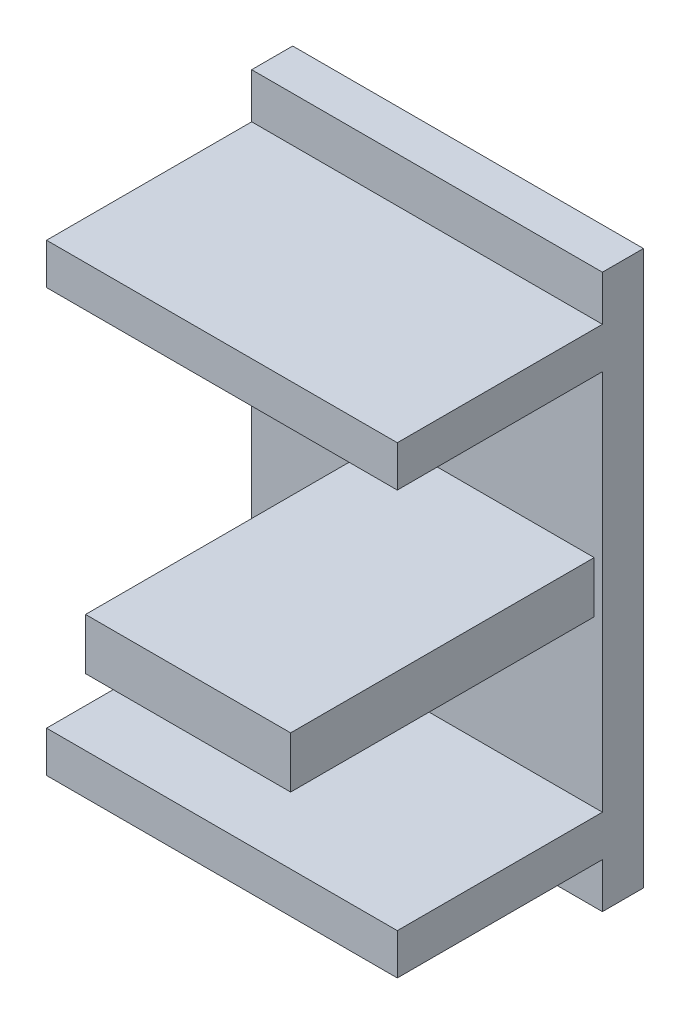
ISO-10303-21;
HEADER;
FILE_DESCRIPTION(('STEP AP214'),'2;1');
FILE_NAME('part.step','',(''),(''),'','','');
FILE_SCHEMA(('AUTOMOTIVE_DESIGN { 1 0 10303 214 1 1 1 1 }'));
ENDSEC;
DATA;
#1=APPLICATION_CONTEXT('core data for automotive mechanical design processes');
#2=APPLICATION_PROTOCOL_DEFINITION('international standard','automotive_design',2000,#1);
#3=PRODUCT_CONTEXT('',#1,'mechanical');
#4=PRODUCT('Part','Part','',(#3));
#5=PRODUCT_RELATED_PRODUCT_CATEGORY('part','',(#4));
#6=PRODUCT_DEFINITION_FORMATION('','',#4);
#7=PRODUCT_DEFINITION_CONTEXT('part definition',#1,'design');
#8=PRODUCT_DEFINITION('design','',#6,#7);
#9=PRODUCT_DEFINITION_SHAPE('','',#8);
#10=(LENGTH_UNIT() NAMED_UNIT(*) SI_UNIT(.MILLI.,.METRE.));
#11=(NAMED_UNIT(*) PLANE_ANGLE_UNIT() SI_UNIT($,.RADIAN.));
#12=(NAMED_UNIT(*) SI_UNIT($,.STERADIAN.) SOLID_ANGLE_UNIT());
#13=UNCERTAINTY_MEASURE_WITH_UNIT(LENGTH_MEASURE(1.E-05),#10,'distance_accuracy_value','');
#14=(GEOMETRIC_REPRESENTATION_CONTEXT(3) GLOBAL_UNCERTAINTY_ASSIGNED_CONTEXT((#13)) GLOBAL_UNIT_ASSIGNED_CONTEXT((#10,
#11,#12)) REPRESENTATION_CONTEXT('',''));
#15=CARTESIAN_POINT('',(0.,0.,0.));
#16=DIRECTION('',(0.,0.,1.));
#17=DIRECTION('',(1.,0.,0.));
#18=AXIS2_PLACEMENT_3D('',#15,#16,#17);
#19=CARTESIAN_POINT('',(0.,0.,5.08));
#20=DIRECTION('',(0.,0.,-1.));
#21=DIRECTION('',(-1.,0.,0.));
#22=AXIS2_PLACEMENT_3D('',#19,#20,#21);
#23=PLANE('',#22);
#24=DIRECTION('',(-1.,0.,0.));
#25=VECTOR('',#24,1.);
#26=CARTESIAN_POINT('',(-43.434,10.668,5.08));
#27=LINE('',#26,#25);
#28=CARTESIAN_POINT('',(0.,10.668,5.08));
#29=VERTEX_POINT('',#28);
#30=CARTESIAN_POINT('',(-43.434,10.668,5.08));
#31=VERTEX_POINT('',#30);
#32=EDGE_CURVE('E199',#29,#31,#27,.T.);
#33=ORIENTED_EDGE('',*,*,#32,.F.);
#34=DIRECTION('',(0.,1.,0.));
#35=VECTOR('',#34,1.);
#36=CARTESIAN_POINT('',(0.,0.,5.08));
#37=LINE('',#36,#35);
#38=CARTESIAN_POINT('',(0.,57.912,5.08));
#39=VERTEX_POINT('',#38);
#40=EDGE_CURVE('E274',#29,#39,#37,.T.);
#41=ORIENTED_EDGE('',*,*,#40,.T.);
#42=DIRECTION('',(1.,0.,0.));
#43=VECTOR('',#42,1.);
#44=CARTESIAN_POINT('',(-43.434,57.912,5.08));
#45=LINE('',#44,#43);
#46=CARTESIAN_POINT('',(-43.434,57.912,5.08));
#47=VERTEX_POINT('',#46);
#48=EDGE_CURVE('E213',#47,#39,#45,.T.);
#49=ORIENTED_EDGE('',*,*,#48,.F.);
#50=DIRECTION('',(0.,-1.,0.));
#51=VECTOR('',#50,1.);
#52=CARTESIAN_POINT('',(-43.434,0.,5.08));
#53=LINE('',#52,#51);
#54=EDGE_CURVE('E282',#47,#31,#53,.T.);
#55=ORIENTED_EDGE('',*,*,#54,.T.);
#56=EDGE_LOOP('',(#33,#41,#49,#55));
#57=FACE_BOUND('',#56,.T.);
#58=DIRECTION('',(0.,-1.,0.));
#59=VECTOR('',#58,1.);
#60=CARTESIAN_POINT('',(-26.416,31.115,5.08));
#61=LINE('',#60,#59);
#62=CARTESIAN_POINT('',(-26.416,37.465,5.08));
#63=VERTEX_POINT('',#62);
#64=CARTESIAN_POINT('',(-26.416,31.115,5.08));
#65=VERTEX_POINT('',#64);
#66=EDGE_CURVE('E181',#63,#65,#61,.T.);
#67=ORIENTED_EDGE('',*,*,#66,.F.);
#68=DIRECTION('',(-1.,0.,0.));
#69=VECTOR('',#68,1.);
#70=CARTESIAN_POINT('',(-26.416,37.465,5.08));
#71=LINE('',#70,#69);
#72=CARTESIAN_POINT('',(-1.01600000000001,37.465,5.08));
#73=VERTEX_POINT('',#72);
#74=EDGE_CURVE('E178',#73,#63,#71,.T.);
#75=ORIENTED_EDGE('',*,*,#74,.F.);
#76=DIRECTION('',(0.,1.,0.));
#77=VECTOR('',#76,1.);
#78=CARTESIAN_POINT('',(-1.01600000000001,31.115,5.08));
#79=LINE('',#78,#77);
#80=CARTESIAN_POINT('',(-1.01600000000001,31.115,5.08));
#81=VERTEX_POINT('',#80);
#82=EDGE_CURVE('E66',#81,#73,#79,.T.);
#83=ORIENTED_EDGE('',*,*,#82,.F.);
#84=DIRECTION('',(1.,0.,0.));
#85=VECTOR('',#84,1.);
#86=CARTESIAN_POINT('',(-26.416,31.115,5.08));
#87=LINE('',#86,#85);
#88=EDGE_CURVE('E61',#65,#81,#87,.T.);
#89=ORIENTED_EDGE('',*,*,#88,.F.);
#90=EDGE_LOOP('',(#67,#75,#83,#89));
#91=FACE_BOUND('',#90,.T.);
#92=ADVANCED_FACE('F45',(#57,#91),#23,.F.);
#93=DIRECTION('',(1.,0.,0.));
#94=VECTOR('',#93,1.);
#95=CARTESIAN_POINT('',(-43.434,5.588,5.08));
#96=LINE('',#95,#94);
#97=CARTESIAN_POINT('',(-43.434,5.588,5.08));
#98=VERTEX_POINT('',#97);
#99=CARTESIAN_POINT('',(0.,5.588,5.08));
#100=VERTEX_POINT('',#99);
#101=EDGE_CURVE('E209',#98,#100,#96,.T.);
#102=ORIENTED_EDGE('',*,*,#101,.F.);
#103=CARTESIAN_POINT('',(-43.434,0.,5.08));
#104=VERTEX_POINT('',#103);
#105=EDGE_CURVE('E277',#98,#104,#53,.T.);
#106=ORIENTED_EDGE('',*,*,#105,.T.);
#107=DIRECTION('',(1.,0.,0.));
#108=VECTOR('',#107,1.);
#109=CARTESIAN_POINT('',(0.,0.,5.08));
#110=LINE('',#109,#108);
#111=CARTESIAN_POINT('',(0.,0.,5.08));
#112=VERTEX_POINT('',#111);
#113=EDGE_CURVE('E264',#104,#112,#110,.T.);
#114=ORIENTED_EDGE('',*,*,#113,.T.);
#115=EDGE_CURVE('E270',#112,#100,#37,.T.);
#116=ORIENTED_EDGE('',*,*,#115,.T.);
#117=EDGE_LOOP('',(#102,#106,#114,#116));
#118=FACE_BOUND('',#117,.T.);
#119=ADVANCED_FACE('F323',(#118),#23,.F.);
#120=DIRECTION('',(-1.,0.,0.));
#121=VECTOR('',#120,1.);
#122=CARTESIAN_POINT('',(-43.434,62.992,5.08));
#123=LINE('',#122,#121);
#124=CARTESIAN_POINT('',(0.,62.992,5.08));
#125=VERTEX_POINT('',#124);
#126=CARTESIAN_POINT('',(-43.434,62.992,5.08));
#127=VERTEX_POINT('',#126);
#128=EDGE_CURVE('E245',#125,#127,#123,.T.);
#129=ORIENTED_EDGE('',*,*,#128,.F.);
#130=CARTESIAN_POINT('',(0.,68.58,5.08));
#131=VERTEX_POINT('',#130);
#132=EDGE_CURVE('E268',#125,#131,#37,.T.);
#133=ORIENTED_EDGE('',*,*,#132,.T.);
#134=DIRECTION('',(-1.,0.,0.));
#135=VECTOR('',#134,1.);
#136=CARTESIAN_POINT('',(0.,68.58,5.08));
#137=LINE('',#136,#135);
#138=CARTESIAN_POINT('',(-43.434,68.58,5.08));
#139=VERTEX_POINT('',#138);
#140=EDGE_CURVE('E273',#131,#139,#137,.T.);
#141=ORIENTED_EDGE('',*,*,#140,.T.);
#142=EDGE_CURVE('E278',#139,#127,#53,.T.);
#143=ORIENTED_EDGE('',*,*,#142,.T.);
#144=EDGE_LOOP('',(#129,#133,#141,#143));
#145=FACE_BOUND('',#144,.T.);
#146=ADVANCED_FACE('F347',(#145),#23,.F.);
#147=CARTESIAN_POINT('',(0.,0.,5.08));
#148=DIRECTION('',(0.,1.,0.));
#149=DIRECTION('',(0.,0.,1.));
#150=AXIS2_PLACEMENT_3D('',#147,#148,#149);
#151=PLANE('',#150);
#152=DIRECTION('',(1.,0.,0.));
#153=VECTOR('',#152,1.);
#154=CARTESIAN_POINT('',(0.,0.,0.));
#155=LINE('',#154,#153);
#156=CARTESIAN_POINT('',(-43.434,0.,0.));
#157=VERTEX_POINT('',#156);
#158=CARTESIAN_POINT('',(0.,0.,0.));
#159=VERTEX_POINT('',#158);
#160=EDGE_CURVE('E231',#157,#159,#155,.T.);
#161=ORIENTED_EDGE('',*,*,#160,.T.);
#162=DIRECTION('',(0.,0.,-1.));
#163=VECTOR('',#162,1.);
#164=CARTESIAN_POINT('',(0.,0.,5.08));
#165=LINE('',#164,#163);
#166=EDGE_CURVE('E11',#112,#159,#165,.T.);
#167=ORIENTED_EDGE('',*,*,#166,.F.);
#168=ORIENTED_EDGE('',*,*,#113,.F.);
#169=DIRECTION('',(0.,0.,-1.));
#170=VECTOR('',#169,1.);
#171=CARTESIAN_POINT('',(-43.434,0.,5.08));
#172=LINE('',#171,#170);
#173=EDGE_CURVE('E281',#104,#157,#172,.T.);
#174=ORIENTED_EDGE('',*,*,#173,.T.);
#175=EDGE_LOOP('',(#161,#167,#168,#174));
#176=FACE_BOUND('',#175,.T.);
#177=ADVANCED_FACE('F47',(#176),#151,.F.);
#178=CARTESIAN_POINT('',(0.,0.,5.08));
#179=DIRECTION('',(-1.,0.,0.));
#180=DIRECTION('',(0.,0.,1.));
#181=AXIS2_PLACEMENT_3D('',#178,#179,#180);
#182=PLANE('',#181);
#183=DIRECTION('',(0.,1.,0.));
#184=VECTOR('',#183,1.);
#185=CARTESIAN_POINT('',(0.,0.,0.));
#186=LINE('',#185,#184);
#187=CARTESIAN_POINT('',(0.,68.58,0.));
#188=VERTEX_POINT('',#187);
#189=EDGE_CURVE('E286',#159,#188,#186,.T.);
#190=ORIENTED_EDGE('',*,*,#189,.T.);
#191=DIRECTION('',(0.,0.,-1.));
#192=VECTOR('',#191,1.);
#193=CARTESIAN_POINT('',(0.,68.58,5.08));
#194=LINE('',#193,#192);
#195=EDGE_CURVE('E54',#131,#188,#194,.T.);
#196=ORIENTED_EDGE('',*,*,#195,.F.);
#197=ORIENTED_EDGE('',*,*,#132,.F.);
#198=DIRECTION('',(0.,0.,-1.));
#199=VECTOR('',#198,1.);
#200=CARTESIAN_POINT('',(0.,62.992,30.48));
#201=LINE('',#200,#199);
#202=CARTESIAN_POINT('',(0.,62.992,30.48));
#203=VERTEX_POINT('',#202);
#204=EDGE_CURVE('E236',#203,#125,#201,.T.);
#205=ORIENTED_EDGE('',*,*,#204,.F.);
#206=DIRECTION('',(0.,1.,0.));
#207=VECTOR('',#206,1.);
#208=CARTESIAN_POINT('',(0.,57.912,30.48));
#209=LINE('',#208,#207);
#210=CARTESIAN_POINT('',(0.,57.912,30.48));
#211=VERTEX_POINT('',#210);
#212=EDGE_CURVE('E255',#211,#203,#209,.T.);
#213=ORIENTED_EDGE('',*,*,#212,.F.);
#214=DIRECTION('',(0.,0.,-1.));
#215=VECTOR('',#214,1.);
#216=CARTESIAN_POINT('',(0.,57.912,30.48));
#217=LINE('',#216,#215);
#218=EDGE_CURVE('E188',#211,#39,#217,.T.);
#219=ORIENTED_EDGE('',*,*,#218,.T.);
#220=ORIENTED_EDGE('',*,*,#40,.F.);
#221=DIRECTION('',(0.,0.,-1.));
#222=VECTOR('',#221,1.);
#223=CARTESIAN_POINT('',(0.,10.668,30.48));
#224=LINE('',#223,#222);
#225=CARTESIAN_POINT('',(0.,10.668,30.48));
#226=VERTEX_POINT('',#225);
#227=EDGE_CURVE('E220',#226,#29,#224,.T.);
#228=ORIENTED_EDGE('',*,*,#227,.F.);
#229=DIRECTION('',(0.,1.,0.));
#230=VECTOR('',#229,1.);
#231=CARTESIAN_POINT('',(0.,5.588,30.48));
#232=LINE('',#231,#230);
#233=CARTESIAN_POINT('',(0.,5.588,30.48));
#234=VERTEX_POINT('',#233);
#235=EDGE_CURVE('E202',#234,#226,#232,.T.);
#236=ORIENTED_EDGE('',*,*,#235,.F.);
#237=DIRECTION('',(0.,0.,-1.));
#238=VECTOR('',#237,1.);
#239=CARTESIAN_POINT('',(0.,5.588,30.48));
#240=LINE('',#239,#238);
#241=EDGE_CURVE('E224',#234,#100,#240,.T.);
#242=ORIENTED_EDGE('',*,*,#241,.T.);
#243=ORIENTED_EDGE('',*,*,#115,.F.);
#244=ORIENTED_EDGE('',*,*,#166,.T.);
#245=EDGE_LOOP('',(#190,#196,#197,#205,#213,#219,#220,#228,#236,#242,#243,#244));
#246=FACE_BOUND('',#245,.T.);
#247=ADVANCED_FACE('F341',(#246),#182,.F.);
#248=CARTESIAN_POINT('',(0.,68.58,5.08));
#249=DIRECTION('',(0.,-1.,0.));
#250=DIRECTION('',(0.,0.,-1.));
#251=AXIS2_PLACEMENT_3D('',#248,#249,#250);
#252=PLANE('',#251);
#253=DIRECTION('',(-1.,0.,0.));
#254=VECTOR('',#253,1.);
#255=CARTESIAN_POINT('',(0.,68.58,0.));
#256=LINE('',#255,#254);
#257=CARTESIAN_POINT('',(-43.434,68.58,0.));
#258=VERTEX_POINT('',#257);
#259=EDGE_CURVE('E289',#188,#258,#256,.T.);
#260=ORIENTED_EDGE('',*,*,#259,.T.);
#261=DIRECTION('',(0.,0.,-1.));
#262=VECTOR('',#261,1.);
#263=CARTESIAN_POINT('',(-43.434,68.58,5.08));
#264=LINE('',#263,#262);
#265=EDGE_CURVE('E297',#139,#258,#264,.T.);
#266=ORIENTED_EDGE('',*,*,#265,.F.);
#267=ORIENTED_EDGE('',*,*,#140,.F.);
#268=ORIENTED_EDGE('',*,*,#195,.T.);
#269=EDGE_LOOP('',(#260,#266,#267,#268));
#270=FACE_BOUND('',#269,.T.);
#271=ADVANCED_FACE('F306',(#270),#252,.F.);
#272=CARTESIAN_POINT('',(-43.434,0.,5.08));
#273=DIRECTION('',(1.,0.,0.));
#274=DIRECTION('',(0.,0.,-1.));
#275=AXIS2_PLACEMENT_3D('',#272,#273,#274);
#276=PLANE('',#275);
#277=DIRECTION('',(0.,-1.,0.));
#278=VECTOR('',#277,1.);
#279=CARTESIAN_POINT('',(-43.434,0.,0.));
#280=LINE('',#279,#278);
#281=EDGE_CURVE('E269',#258,#157,#280,.T.);
#282=ORIENTED_EDGE('',*,*,#281,.T.);
#283=ORIENTED_EDGE('',*,*,#173,.F.);
#284=ORIENTED_EDGE('',*,*,#105,.F.);
#285=DIRECTION('',(0.,0.,-1.));
#286=VECTOR('',#285,1.);
#287=CARTESIAN_POINT('',(-43.434,5.588,30.48));
#288=LINE('',#287,#286);
#289=CARTESIAN_POINT('',(-43.434,5.588,30.48));
#290=VERTEX_POINT('',#289);
#291=EDGE_CURVE('E228',#290,#98,#288,.T.);
#292=ORIENTED_EDGE('',*,*,#291,.F.);
#293=DIRECTION('',(0.,-1.,0.));
#294=VECTOR('',#293,1.);
#295=CARTESIAN_POINT('',(-43.434,5.588,30.48));
#296=LINE('',#295,#294);
#297=CARTESIAN_POINT('',(-43.434,10.668,30.48));
#298=VERTEX_POINT('',#297);
#299=EDGE_CURVE('E194',#298,#290,#296,.T.);
#300=ORIENTED_EDGE('',*,*,#299,.F.);
#301=DIRECTION('',(0.,0.,-1.));
#302=VECTOR('',#301,1.);
#303=CARTESIAN_POINT('',(-43.434,10.668,30.48));
#304=LINE('',#303,#302);
#305=EDGE_CURVE('E208',#298,#31,#304,.T.);
#306=ORIENTED_EDGE('',*,*,#305,.T.);
#307=ORIENTED_EDGE('',*,*,#54,.F.);
#308=DIRECTION('',(0.,0.,-1.));
#309=VECTOR('',#308,1.);
#310=CARTESIAN_POINT('',(-43.434,57.912,30.48));
#311=LINE('',#310,#309);
#312=CARTESIAN_POINT('',(-43.434,57.912,30.48));
#313=VERTEX_POINT('',#312);
#314=EDGE_CURVE('E183',#313,#47,#311,.T.);
#315=ORIENTED_EDGE('',*,*,#314,.F.);
#316=DIRECTION('',(0.,-1.,0.));
#317=VECTOR('',#316,1.);
#318=CARTESIAN_POINT('',(-43.434,57.912,30.48));
#319=LINE('',#318,#317);
#320=CARTESIAN_POINT('',(-43.434,62.992,30.48));
#321=VERTEX_POINT('',#320);
#322=EDGE_CURVE('E249',#321,#313,#319,.T.);
#323=ORIENTED_EDGE('',*,*,#322,.F.);
#324=DIRECTION('',(0.,0.,-1.));
#325=VECTOR('',#324,1.);
#326=CARTESIAN_POINT('',(-43.434,62.992,30.48));
#327=LINE('',#326,#325);
#328=EDGE_CURVE('E240',#321,#127,#327,.T.);
#329=ORIENTED_EDGE('',*,*,#328,.T.);
#330=ORIENTED_EDGE('',*,*,#142,.F.);
#331=ORIENTED_EDGE('',*,*,#265,.T.);
#332=EDGE_LOOP('',(#282,#283,#284,#292,#300,#306,#307,#315,#323,#329,#330,#331));
#333=FACE_BOUND('',#332,.T.);
#334=ADVANCED_FACE('F316',(#333),#276,.F.);
#335=CARTESIAN_POINT('',(0.,0.,0.));
#336=DIRECTION('',(0.,0.,-1.));
#337=DIRECTION('',(-1.,0.,0.));
#338=AXIS2_PLACEMENT_3D('',#335,#336,#337);
#339=PLANE('',#338);
#340=ORIENTED_EDGE('',*,*,#160,.F.);
#341=ORIENTED_EDGE('',*,*,#281,.F.);
#342=ORIENTED_EDGE('',*,*,#259,.F.);
#343=ORIENTED_EDGE('',*,*,#189,.F.);
#344=EDGE_LOOP('',(#340,#341,#342,#343));
#345=FACE_BOUND('',#344,.T.);
#346=ADVANCED_FACE('F313',(#345),#339,.T.);
#347=CARTESIAN_POINT('',(-43.434,57.912,30.48));
#348=DIRECTION('',(0.,1.,0.));
#349=DIRECTION('',(0.,0.,1.));
#350=AXIS2_PLACEMENT_3D('',#347,#348,#349);
#351=PLANE('',#350);
#352=ORIENTED_EDGE('',*,*,#48,.T.);
#353=ORIENTED_EDGE('',*,*,#218,.F.);
#354=DIRECTION('',(1.,0.,0.));
#355=VECTOR('',#354,1.);
#356=CARTESIAN_POINT('',(-43.434,57.912,30.48));
#357=LINE('',#356,#355);
#358=EDGE_CURVE('E258',#313,#211,#357,.T.);
#359=ORIENTED_EDGE('',*,*,#358,.F.);
#360=ORIENTED_EDGE('',*,*,#314,.T.);
#361=EDGE_LOOP('',(#352,#353,#359,#360));
#362=FACE_BOUND('',#361,.T.);
#363=ADVANCED_FACE('F357',(#362),#351,.F.);
#364=CARTESIAN_POINT('',(-43.434,62.992,30.48));
#365=DIRECTION('',(0.,-1.,0.));
#366=DIRECTION('',(0.,0.,-1.));
#367=AXIS2_PLACEMENT_3D('',#364,#365,#366);
#368=PLANE('',#367);
#369=ORIENTED_EDGE('',*,*,#128,.T.);
#370=ORIENTED_EDGE('',*,*,#328,.F.);
#371=DIRECTION('',(-1.,0.,0.));
#372=VECTOR('',#371,1.);
#373=CARTESIAN_POINT('',(-43.434,62.992,30.48));
#374=LINE('',#373,#372);
#375=EDGE_CURVE('E244',#203,#321,#374,.T.);
#376=ORIENTED_EDGE('',*,*,#375,.F.);
#377=ORIENTED_EDGE('',*,*,#204,.T.);
#378=EDGE_LOOP('',(#369,#370,#376,#377));
#379=FACE_BOUND('',#378,.T.);
#380=ADVANCED_FACE('F351',(#379),#368,.F.);
#381=CARTESIAN_POINT('',(0.,0.,30.48));
#382=DIRECTION('',(0.,0.,-1.));
#383=DIRECTION('',(-1.,0.,0.));
#384=AXIS2_PLACEMENT_3D('',#381,#382,#383);
#385=PLANE('',#384);
#386=ORIENTED_EDGE('',*,*,#322,.T.);
#387=ORIENTED_EDGE('',*,*,#358,.T.);
#388=ORIENTED_EDGE('',*,*,#212,.T.);
#389=ORIENTED_EDGE('',*,*,#375,.T.);
#390=EDGE_LOOP('',(#386,#387,#388,#389));
#391=FACE_BOUND('',#390,.T.);
#392=ADVANCED_FACE('F355',(#391),#385,.F.);
#393=CARTESIAN_POINT('',(-43.434,5.588,30.48));
#394=DIRECTION('',(0.,1.,0.));
#395=DIRECTION('',(-1.,0.,0.));
#396=AXIS2_PLACEMENT_3D('',#393,#394,#395);
#397=PLANE('',#396);
#398=ORIENTED_EDGE('',*,*,#101,.T.);
#399=ORIENTED_EDGE('',*,*,#241,.F.);
#400=DIRECTION('',(1.,0.,0.));
#401=VECTOR('',#400,1.);
#402=CARTESIAN_POINT('',(-43.434,5.588,30.48));
#403=LINE('',#402,#401);
#404=EDGE_CURVE('E198',#290,#234,#403,.T.);
#405=ORIENTED_EDGE('',*,*,#404,.F.);
#406=ORIENTED_EDGE('',*,*,#291,.T.);
#407=EDGE_LOOP('',(#398,#399,#405,#406));
#408=FACE_BOUND('',#407,.T.);
#409=ADVANCED_FACE('F413',(#408),#397,.F.);
#410=CARTESIAN_POINT('',(-43.434,10.668,30.48));
#411=DIRECTION('',(0.,-1.,0.));
#412=DIRECTION('',(0.,0.,-1.));
#413=AXIS2_PLACEMENT_3D('',#410,#411,#412);
#414=PLANE('',#413);
#415=ORIENTED_EDGE('',*,*,#32,.T.);
#416=ORIENTED_EDGE('',*,*,#305,.F.);
#417=DIRECTION('',(-1.,0.,0.));
#418=VECTOR('',#417,1.);
#419=CARTESIAN_POINT('',(-43.434,10.668,30.48));
#420=LINE('',#419,#418);
#421=EDGE_CURVE('E205',#226,#298,#420,.T.);
#422=ORIENTED_EDGE('',*,*,#421,.F.);
#423=ORIENTED_EDGE('',*,*,#227,.T.);
#424=EDGE_LOOP('',(#415,#416,#422,#423));
#425=FACE_BOUND('',#424,.T.);
#426=ADVANCED_FACE('F333',(#425),#414,.F.);
#427=CARTESIAN_POINT('',(0.,0.,30.48));
#428=DIRECTION('',(0.,0.,-1.));
#429=DIRECTION('',(-1.,0.,0.));
#430=AXIS2_PLACEMENT_3D('',#427,#428,#429);
#431=PLANE('',#430);
#432=ORIENTED_EDGE('',*,*,#299,.T.);
#433=ORIENTED_EDGE('',*,*,#404,.T.);
#434=ORIENTED_EDGE('',*,*,#235,.T.);
#435=ORIENTED_EDGE('',*,*,#421,.T.);
#436=EDGE_LOOP('',(#432,#433,#434,#435));
#437=FACE_BOUND('',#436,.T.);
#438=ADVANCED_FACE('F338',(#437),#431,.F.);
#439=CARTESIAN_POINT('',(-26.416,31.115,42.672));
#440=DIRECTION('',(1.,0.,0.));
#441=DIRECTION('',(0.,0.,-1.));
#442=AXIS2_PLACEMENT_3D('',#439,#440,#441);
#443=PLANE('',#442);
#444=ORIENTED_EDGE('',*,*,#66,.T.);
#445=DIRECTION('',(0.,0.,-1.));
#446=VECTOR('',#445,1.);
#447=CARTESIAN_POINT('',(-26.416,31.115,42.672));
#448=LINE('',#447,#446);
#449=CARTESIAN_POINT('',(-26.416,31.115,42.672));
#450=VERTEX_POINT('',#449);
#451=EDGE_CURVE('E160',#450,#65,#448,.T.);
#452=ORIENTED_EDGE('',*,*,#451,.F.);
#453=DIRECTION('',(0.,-1.,0.));
#454=VECTOR('',#453,1.);
#455=CARTESIAN_POINT('',(-26.416,31.115,42.672));
#456=LINE('',#455,#454);
#457=CARTESIAN_POINT('',(-26.416,37.465,42.672));
#458=VERTEX_POINT('',#457);
#459=EDGE_CURVE('E168',#458,#450,#456,.T.);
#460=ORIENTED_EDGE('',*,*,#459,.F.);
#461=DIRECTION('',(0.,0.,-1.));
#462=VECTOR('',#461,1.);
#463=CARTESIAN_POINT('',(-26.416,37.465,42.672));
#464=LINE('',#463,#462);
#465=EDGE_CURVE('E487',#458,#63,#464,.T.);
#466=ORIENTED_EDGE('',*,*,#465,.T.);
#467=EDGE_LOOP('',(#444,#452,#460,#466));
#468=FACE_BOUND('',#467,.T.);
#469=ADVANCED_FACE('F180',(#468),#443,.F.);
#470=CARTESIAN_POINT('',(-26.416,31.115,42.672));
#471=DIRECTION('',(0.,1.,0.));
#472=DIRECTION('',(0.,0.,1.));
#473=AXIS2_PLACEMENT_3D('',#470,#471,#472);
#474=PLANE('',#473);
#475=ORIENTED_EDGE('',*,*,#88,.T.);
#476=DIRECTION('',(0.,0.,-1.));
#477=VECTOR('',#476,1.);
#478=CARTESIAN_POINT('',(-1.01600000000001,31.115,42.672));
#479=LINE('',#478,#477);
#480=CARTESIAN_POINT('',(-1.01600000000001,31.115,42.672));
#481=VERTEX_POINT('',#480);
#482=EDGE_CURVE('E163',#481,#81,#479,.T.);
#483=ORIENTED_EDGE('',*,*,#482,.F.);
#484=DIRECTION('',(1.,0.,0.));
#485=VECTOR('',#484,1.);
#486=CARTESIAN_POINT('',(-26.416,31.115,42.672));
#487=LINE('',#486,#485);
#488=EDGE_CURVE('E156',#450,#481,#487,.T.);
#489=ORIENTED_EDGE('',*,*,#488,.F.);
#490=ORIENTED_EDGE('',*,*,#451,.T.);
#491=EDGE_LOOP('',(#475,#483,#489,#490));
#492=FACE_BOUND('',#491,.T.);
#493=ADVANCED_FACE('F158',(#492),#474,.F.);
#494=CARTESIAN_POINT('',(-1.01600000000001,31.115,42.672));
#495=DIRECTION('',(-1.,0.,0.));
#496=DIRECTION('',(0.,0.,1.));
#497=AXIS2_PLACEMENT_3D('',#494,#495,#496);
#498=PLANE('',#497);
#499=ORIENTED_EDGE('',*,*,#82,.T.);
#500=DIRECTION('',(0.,0.,-1.));
#501=VECTOR('',#500,1.);
#502=CARTESIAN_POINT('',(-1.01600000000001,37.465,42.672));
#503=LINE('',#502,#501);
#504=CARTESIAN_POINT('',(-1.01600000000001,37.465,42.672));
#505=VERTEX_POINT('',#504);
#506=EDGE_CURVE('E190',#505,#73,#503,.T.);
#507=ORIENTED_EDGE('',*,*,#506,.F.);
#508=DIRECTION('',(0.,1.,0.));
#509=VECTOR('',#508,1.);
#510=CARTESIAN_POINT('',(-1.01600000000001,31.115,42.672));
#511=LINE('',#510,#509);
#512=EDGE_CURVE('E167',#481,#505,#511,.T.);
#513=ORIENTED_EDGE('',*,*,#512,.F.);
#514=ORIENTED_EDGE('',*,*,#482,.T.);
#515=EDGE_LOOP('',(#499,#507,#513,#514));
#516=FACE_BOUND('',#515,.T.);
#517=ADVANCED_FACE('F455',(#516),#498,.F.);
#518=CARTESIAN_POINT('',(-26.416,37.465,42.672));
#519=DIRECTION('',(0.,-1.,0.));
#520=DIRECTION('',(0.,0.,-1.));
#521=AXIS2_PLACEMENT_3D('',#518,#519,#520);
#522=PLANE('',#521);
#523=ORIENTED_EDGE('',*,*,#74,.T.);
#524=ORIENTED_EDGE('',*,*,#465,.F.);
#525=DIRECTION('',(-1.,0.,0.));
#526=VECTOR('',#525,1.);
#527=CARTESIAN_POINT('',(-26.416,37.465,42.672));
#528=LINE('',#527,#526);
#529=EDGE_CURVE('E173',#505,#458,#528,.T.);
#530=ORIENTED_EDGE('',*,*,#529,.F.);
#531=ORIENTED_EDGE('',*,*,#506,.T.);
#532=EDGE_LOOP('',(#523,#524,#530,#531));
#533=FACE_BOUND('',#532,.T.);
#534=ADVANCED_FACE('F464',(#533),#522,.F.);
#535=CARTESIAN_POINT('',(0.,0.,42.672));
#536=DIRECTION('',(0.,0.,-1.));
#537=DIRECTION('',(-1.,0.,0.));
#538=AXIS2_PLACEMENT_3D('',#535,#536,#537);
#539=PLANE('',#538);
#540=ORIENTED_EDGE('',*,*,#459,.T.);
#541=ORIENTED_EDGE('',*,*,#488,.T.);
#542=ORIENTED_EDGE('',*,*,#512,.T.);
#543=ORIENTED_EDGE('',*,*,#529,.T.);
#544=EDGE_LOOP('',(#540,#541,#542,#543));
#545=FACE_BOUND('',#544,.T.);
#546=ADVANCED_FACE('F171',(#545),#539,.F.);
#547=CLOSED_SHELL('',(#92,#119,#146,#177,#247,#271,#334,#346,#363,#380,#392,#409,#426,#438,#469,
#493,#517,#534,#546));
#548=MANIFOLD_SOLID_BREP('B2',#547);
#549=ADVANCED_BREP_SHAPE_REPRESENTATION('',(#18,#548),#14);
#550=SHAPE_DEFINITION_REPRESENTATION(#9,#549);
ENDSEC;
END-ISO-10303-21;
